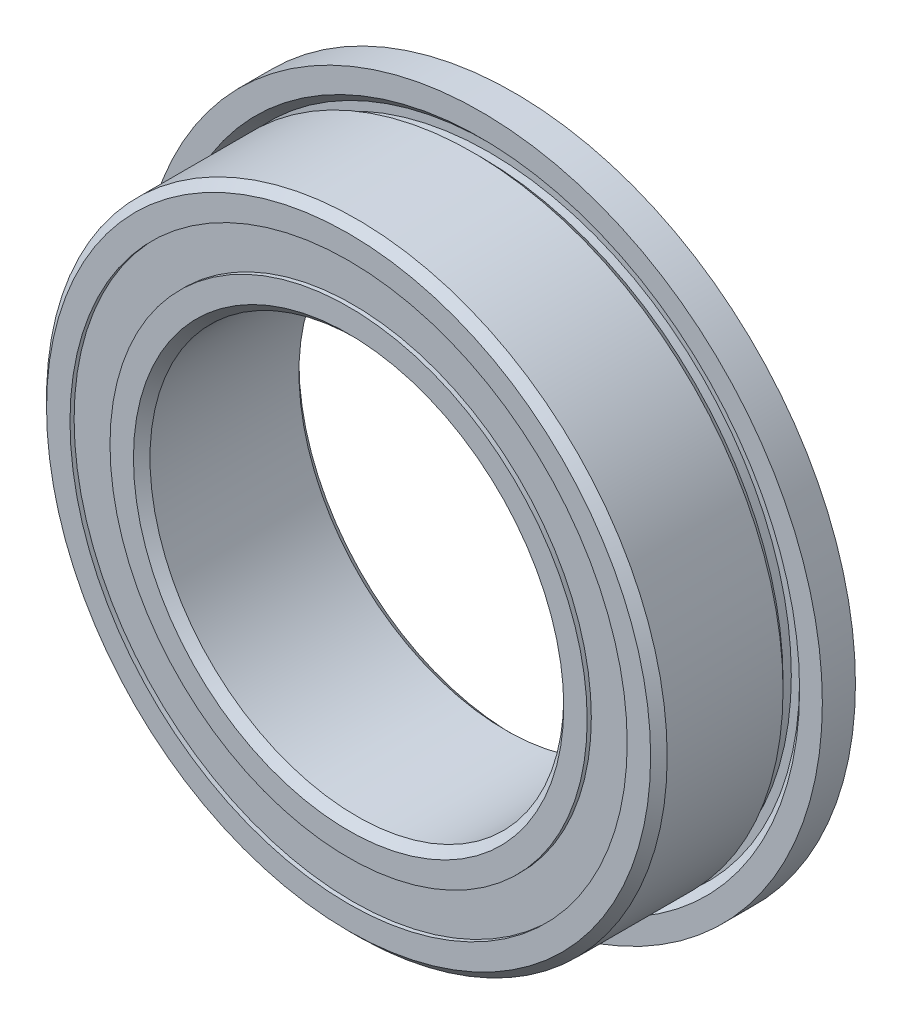
ISO-10303-21;
HEADER;
FILE_DESCRIPTION(('STEP AP214'),'2;1');
FILE_NAME('part.step','',(''),(''),'','','');
FILE_SCHEMA(('AUTOMOTIVE_DESIGN { 1 0 10303 214 1 1 1 1 }'));
ENDSEC;
DATA;
#1=APPLICATION_CONTEXT('core data for automotive mechanical design processes');
#2=APPLICATION_PROTOCOL_DEFINITION('international standard','automotive_design',2000,#1);
#3=PRODUCT_CONTEXT('',#1,'mechanical');
#4=PRODUCT('Part','Part','',(#3));
#5=PRODUCT_RELATED_PRODUCT_CATEGORY('part','',(#4));
#6=PRODUCT_DEFINITION_FORMATION('','',#4);
#7=PRODUCT_DEFINITION_CONTEXT('part definition',#1,'design');
#8=PRODUCT_DEFINITION('design','',#6,#7);
#9=PRODUCT_DEFINITION_SHAPE('','',#8);
#10=(LENGTH_UNIT() NAMED_UNIT(*) SI_UNIT(.MILLI.,.METRE.));
#11=(NAMED_UNIT(*) PLANE_ANGLE_UNIT() SI_UNIT($,.RADIAN.));
#12=(NAMED_UNIT(*) SI_UNIT($,.STERADIAN.) SOLID_ANGLE_UNIT());
#13=UNCERTAINTY_MEASURE_WITH_UNIT(LENGTH_MEASURE(1.E-05),#10,'distance_accuracy_value','');
#14=(GEOMETRIC_REPRESENTATION_CONTEXT(3) GLOBAL_UNCERTAINTY_ASSIGNED_CONTEXT((#13)) GLOBAL_UNIT_ASSIGNED_CONTEXT((#10,
#11,#12)) REPRESENTATION_CONTEXT('',''));
#15=CARTESIAN_POINT('',(0.,0.,0.));
#16=DIRECTION('',(0.,0.,1.));
#17=DIRECTION('',(1.,0.,0.));
#18=AXIS2_PLACEMENT_3D('',#15,#16,#17);
#19=CARTESIAN_POINT('',(0.,6.73351648351648,-1.90000000000002));
#20=DIRECTION('',(0.,0.,1.));
#21=DIRECTION('',(1.,0.,0.));
#22=AXIS2_PLACEMENT_3D('',#19,#20,#21);
#23=PLANE('',#22);
#24=CARTESIAN_POINT('',(0.,0.,-1.90000000000002));
#25=DIRECTION('',(0.,0.,1.));
#26=DIRECTION('',(1.,0.,0.));
#27=AXIS2_PLACEMENT_3D('',#24,#25,#26);
#28=CIRCLE('',#27,6.73351648351648);
#29=CARTESIAN_POINT('',(6.73351648351648,0.,-1.90000000000002));
#30=VERTEX_POINT('',#29);
#31=EDGE_CURVE('E57',#30,#30,#28,.T.);
#32=ORIENTED_EDGE('',*,*,#31,.F.);
#33=EDGE_LOOP('',(#32));
#34=FACE_BOUND('',#33,.T.);
#35=CARTESIAN_POINT('',(0.,0.,-1.90000000000002));
#36=DIRECTION('',(0.,0.,1.));
#37=DIRECTION('',(1.,0.,0.));
#38=AXIS2_PLACEMENT_3D('',#35,#36,#37);
#39=CIRCLE('',#38,5.76648351648353);
#40=CARTESIAN_POINT('',(5.76648351648353,0.,-1.90000000000002));
#41=VERTEX_POINT('',#40);
#42=EDGE_CURVE('E11',#41,#41,#39,.T.);
#43=ORIENTED_EDGE('',*,*,#42,.T.);
#44=EDGE_LOOP('',(#43));
#45=FACE_BOUND('',#44,.T.);
#46=ADVANCED_FACE('F43',(#34,#45),#23,.F.);
#47=CARTESIAN_POINT('',(0.,0.,2.));
#48=DIRECTION('',(0.,0.,1.));
#49=DIRECTION('',(1.,0.,0.));
#50=AXIS2_PLACEMENT_3D('',#47,#48,#49);
#51=CYLINDRICAL_SURFACE('',#50,5.76648351648353);
#52=ORIENTED_EDGE('',*,*,#42,.F.);
#53=EDGE_LOOP('',(#52));
#54=FACE_BOUND('',#53,.T.);
#55=CARTESIAN_POINT('',(0.,0.,-1.01188519438831));
#56=DIRECTION('',(0.,0.,1.));
#57=DIRECTION('',(1.,0.,0.));
#58=AXIS2_PLACEMENT_3D('',#55,#56,#57);
#59=CIRCLE('',#58,5.76648351648353);
#60=CARTESIAN_POINT('',(5.76648351648353,0.,-1.01188519438831));
#61=VERTEX_POINT('',#60);
#62=EDGE_CURVE('E49',#61,#61,#59,.T.);
#63=ORIENTED_EDGE('',*,*,#62,.T.);
#64=EDGE_LOOP('',(#63));
#65=FACE_BOUND('',#64,.T.);
#66=ADVANCED_FACE('F66',(#54,#65),#51,.F.);
#67=CARTESIAN_POINT('',(0.,6.73351648351648,-1.01188519438831));
#68=DIRECTION('',(0.,0.,-1.));
#69=DIRECTION('',(-1.,0.,0.));
#70=AXIS2_PLACEMENT_3D('',#67,#68,#69);
#71=PLANE('',#70);
#72=ORIENTED_EDGE('',*,*,#62,.F.);
#73=EDGE_LOOP('',(#72));
#74=FACE_BOUND('',#73,.T.);
#75=CARTESIAN_POINT('',(0.,0.,-1.01188519438831));
#76=DIRECTION('',(0.,0.,1.));
#77=DIRECTION('',(1.,0.,0.));
#78=AXIS2_PLACEMENT_3D('',#75,#76,#77);
#79=CIRCLE('',#78,6.73351648351648);
#80=CARTESIAN_POINT('',(6.73351648351648,0.,-1.01188519438831));
#81=VERTEX_POINT('',#80);
#82=EDGE_CURVE('E53',#81,#81,#79,.T.);
#83=ORIENTED_EDGE('',*,*,#82,.T.);
#84=EDGE_LOOP('',(#83));
#85=FACE_BOUND('',#84,.T.);
#86=ADVANCED_FACE('F70',(#74,#85),#71,.F.);
#87=CARTESIAN_POINT('',(0.,0.,2.));
#88=DIRECTION('',(0.,0.,1.));
#89=DIRECTION('',(1.,0.,0.));
#90=AXIS2_PLACEMENT_3D('',#87,#88,#89);
#91=CYLINDRICAL_SURFACE('',#90,6.73351648351648);
#92=ORIENTED_EDGE('',*,*,#82,.F.);
#93=EDGE_LOOP('',(#92));
#94=FACE_BOUND('',#93,.T.);
#95=ORIENTED_EDGE('',*,*,#31,.T.);
#96=EDGE_LOOP('',(#95));
#97=FACE_BOUND('',#96,.T.);
#98=ADVANCED_FACE('F63',(#94,#97),#91,.T.);
#99=CLOSED_SHELL('',(#46,#66,#86,#98));
#100=MANIFOLD_SOLID_BREP('B2',#99);
#101=CARTESIAN_POINT('',(0.,6.73351648351648,1.90000000000002));
#102=DIRECTION('',(0.,0.,-1.));
#103=DIRECTION('',(-1.,0.,0.));
#104=AXIS2_PLACEMENT_3D('',#101,#102,#103);
#105=PLANE('',#104);
#106=CARTESIAN_POINT('',(0.,0.,1.90000000000002));
#107=DIRECTION('',(0.,0.,1.));
#108=DIRECTION('',(1.,0.,0.));
#109=AXIS2_PLACEMENT_3D('',#106,#107,#108);
#110=CIRCLE('',#109,5.76648351648353);
#111=CARTESIAN_POINT('',(5.76648351648353,0.,1.90000000000002));
#112=VERTEX_POINT('',#111);
#113=EDGE_CURVE('E42',#112,#112,#110,.T.);
#114=ORIENTED_EDGE('',*,*,#113,.F.);
#115=EDGE_LOOP('',(#114));
#116=FACE_BOUND('',#115,.T.);
#117=CARTESIAN_POINT('',(0.,0.,1.90000000000002));
#118=DIRECTION('',(0.,0.,1.));
#119=DIRECTION('',(1.,0.,0.));
#120=AXIS2_PLACEMENT_3D('',#117,#118,#119);
#121=CIRCLE('',#120,6.73351648351648);
#122=CARTESIAN_POINT('',(6.73351648351648,0.,1.90000000000002));
#123=VERTEX_POINT('',#122);
#124=EDGE_CURVE('E124',#123,#123,#121,.T.);
#125=ORIENTED_EDGE('',*,*,#124,.T.);
#126=EDGE_LOOP('',(#125));
#127=FACE_BOUND('',#126,.T.);
#128=ADVANCED_FACE('F110',(#116,#127),#105,.F.);
#129=CARTESIAN_POINT('',(0.,0.,2.));
#130=DIRECTION('',(0.,0.,1.));
#131=DIRECTION('',(1.,0.,0.));
#132=AXIS2_PLACEMENT_3D('',#129,#130,#131);
#133=CYLINDRICAL_SURFACE('',#132,5.76648351648353);
#134=CARTESIAN_POINT('',(0.,0.,1.01188519438831));
#135=DIRECTION('',(0.,0.,1.));
#136=DIRECTION('',(1.,0.,0.));
#137=AXIS2_PLACEMENT_3D('',#134,#135,#136);
#138=CIRCLE('',#137,5.76648351648353);
#139=CARTESIAN_POINT('',(5.76648351648353,0.,1.01188519438831));
#140=VERTEX_POINT('',#139);
#141=EDGE_CURVE('E116',#140,#140,#138,.T.);
#142=ORIENTED_EDGE('',*,*,#141,.F.);
#143=EDGE_LOOP('',(#142));
#144=FACE_BOUND('',#143,.T.);
#145=ORIENTED_EDGE('',*,*,#113,.T.);
#146=EDGE_LOOP('',(#145));
#147=FACE_BOUND('',#146,.T.);
#148=ADVANCED_FACE('F139',(#144,#147),#133,.F.);
#149=CARTESIAN_POINT('',(0.,6.73351648351648,1.01188519438831));
#150=DIRECTION('',(0.,0.,1.));
#151=DIRECTION('',(1.,0.,0.));
#152=AXIS2_PLACEMENT_3D('',#149,#150,#151);
#153=PLANE('',#152);
#154=CARTESIAN_POINT('',(0.,0.,1.01188519438831));
#155=DIRECTION('',(0.,0.,1.));
#156=DIRECTION('',(1.,0.,0.));
#157=AXIS2_PLACEMENT_3D('',#154,#155,#156);
#158=CIRCLE('',#157,6.73351648351648);
#159=CARTESIAN_POINT('',(6.73351648351648,0.,1.01188519438831));
#160=VERTEX_POINT('',#159);
#161=EDGE_CURVE('E120',#160,#160,#158,.T.);
#162=ORIENTED_EDGE('',*,*,#161,.F.);
#163=EDGE_LOOP('',(#162));
#164=FACE_BOUND('',#163,.T.);
#165=ORIENTED_EDGE('',*,*,#141,.T.);
#166=EDGE_LOOP('',(#165));
#167=FACE_BOUND('',#166,.T.);
#168=ADVANCED_FACE('F134',(#164,#167),#153,.F.);
#169=CARTESIAN_POINT('',(0.,0.,2.));
#170=DIRECTION('',(0.,0.,1.));
#171=DIRECTION('',(1.,0.,0.));
#172=AXIS2_PLACEMENT_3D('',#169,#170,#171);
#173=CYLINDRICAL_SURFACE('',#172,6.73351648351648);
#174=ORIENTED_EDGE('',*,*,#124,.F.);
#175=EDGE_LOOP('',(#174));
#176=FACE_BOUND('',#175,.T.);
#177=ORIENTED_EDGE('',*,*,#161,.T.);
#178=EDGE_LOOP('',(#177));
#179=FACE_BOUND('',#178,.T.);
#180=ADVANCED_FACE('F131',(#176,#179),#173,.T.);
#181=CLOSED_SHELL('',(#128,#148,#168,#180));
#182=MANIFOLD_SOLID_BREP('B6',#181);
#183=CARTESIAN_POINT('',(-3.37900510909742,5.25783458019493,0.));
#184=DIRECTION('',(0.,0.,1.));
#185=DIRECTION('',(-0.540640817455587,0.841253532831188,0.));
#186=AXIS2_PLACEMENT_3D('',#183,#184,#185);
#187=SPHERICAL_SURFACE('',#186,1.01188519438831);
#188=CARTESIAN_POINT('',(-3.37900510909742,5.25783458019493,1.01188519438831));
#189=VERTEX_POINT('',#188);
#190=VERTEX_LOOP('',#189);
#191=FACE_BOUND('',#190,.T.);
#192=ADVANCED_FACE('F177',(#191),#187,.T.);
#193=CLOSED_SHELL('',(#192));
#194=MANIFOLD_SOLID_BREP('B37',#193);
#195=CARTESIAN_POINT('',(-5.68519997096571,2.59634383126185,0.));
#196=DIRECTION('',(0.,0.,1.));
#197=DIRECTION('',(-0.909631995354514,0.415415013001897,0.));
#198=AXIS2_PLACEMENT_3D('',#195,#196,#197);
#199=SPHERICAL_SURFACE('',#198,1.01188519438831);
#200=CARTESIAN_POINT('',(-5.68519997096571,2.59634383126185,1.01188519438831));
#201=VERTEX_POINT('',#200);
#202=VERTEX_LOOP('',#201);
#203=FACE_BOUND('',#202,.T.);
#204=ADVANCED_FACE('F197',(#203),#199,.T.);
#205=CLOSED_SHELL('',(#204));
#206=MANIFOLD_SOLID_BREP('B106',#205);
#207=CARTESIAN_POINT('',(-6.18638401175584,-0.889467739207972,0.));
#208=DIRECTION('',(0.,0.,1.));
#209=DIRECTION('',(-0.989821441880934,-0.142314838273276,0.));
#210=AXIS2_PLACEMENT_3D('',#207,#208,#209);
#211=SPHERICAL_SURFACE('',#210,1.01188519438831);
#212=CARTESIAN_POINT('',(-6.18638401175584,-0.889467739207972,1.01188519438831));
#213=VERTEX_POINT('',#212);
#214=VERTEX_LOOP('',#213);
#215=FACE_BOUND('',#214,.T.);
#216=ADVANCED_FACE('F217',(#215),#211,.T.);
#217=CLOSED_SHELL('',(#216));
#218=MANIFOLD_SOLID_BREP('B173',#217);
#219=CARTESIAN_POINT('',(-4.72343483971415,-4.09287958715799,0.));
#220=DIRECTION('',(0.,0.,1.));
#221=DIRECTION('',(-0.755749574354264,-0.654860733945279,0.));
#222=AXIS2_PLACEMENT_3D('',#219,#220,#221);
#223=SPHERICAL_SURFACE('',#222,1.01188519438831);
#224=CARTESIAN_POINT('',(-4.72343483971415,-4.09287958715799,1.01188519438831));
#225=VERTEX_POINT('',#224);
#226=VERTEX_LOOP('',#225);
#227=FACE_BOUND('',#226,.T.);
#228=ADVANCED_FACE('F237',(#227),#223,.T.);
#229=CLOSED_SHELL('',(#228));
#230=MANIFOLD_SOLID_BREP('B193',#229);
#231=CARTESIAN_POINT('',(-1.76082848025898,-5.9968310850906,0.));
#232=DIRECTION('',(0.,0.,1.));
#233=DIRECTION('',(-0.281732556841437,-0.959492973614495,0.));
#234=AXIS2_PLACEMENT_3D('',#231,#232,#233);
#235=SPHERICAL_SURFACE('',#234,1.01188519438831);
#236=CARTESIAN_POINT('',(-1.76082848025898,-5.9968310850906,1.01188519438831));
#237=VERTEX_POINT('',#236);
#238=VERTEX_LOOP('',#237);
#239=FACE_BOUND('',#238,.T.);
#240=ADVANCED_FACE('F257',(#239),#235,.T.);
#241=CLOSED_SHELL('',(#240));
#242=MANIFOLD_SOLID_BREP('B213',#241);
#243=CARTESIAN_POINT('',(1.7608284802589,-5.99683108509062,0.));
#244=DIRECTION('',(0.,0.,1.));
#245=DIRECTION('',(0.281732556841424,-0.959492973614499,0.));
#246=AXIS2_PLACEMENT_3D('',#243,#244,#245);
#247=SPHERICAL_SURFACE('',#246,1.01188519438831);
#248=CARTESIAN_POINT('',(1.7608284802589,-5.99683108509062,1.01188519438831));
#249=VERTEX_POINT('',#248);
#250=VERTEX_LOOP('',#249);
#251=FACE_BOUND('',#250,.T.);
#252=ADVANCED_FACE('F277',(#251),#247,.T.);
#253=CLOSED_SHELL('',(#252));
#254=MANIFOLD_SOLID_BREP('B233',#253);
#255=CARTESIAN_POINT('',(4.7234348397141,-4.09287958715805,0.));
#256=DIRECTION('',(0.,0.,1.));
#257=DIRECTION('',(0.755749574354255,-0.654860733945289,0.));
#258=AXIS2_PLACEMENT_3D('',#255,#256,#257);
#259=SPHERICAL_SURFACE('',#258,1.01188519438831);
#260=CARTESIAN_POINT('',(4.7234348397141,-4.09287958715805,1.01188519438831));
#261=VERTEX_POINT('',#260);
#262=VERTEX_LOOP('',#261);
#263=FACE_BOUND('',#262,.T.);
#264=ADVANCED_FACE('F297',(#263),#259,.T.);
#265=CLOSED_SHELL('',(#264));
#266=MANIFOLD_SOLID_BREP('B253',#265);
#267=CARTESIAN_POINT('',(6.18638401175583,-0.889467739208055,0.));
#268=DIRECTION('',(0.,0.,1.));
#269=DIRECTION('',(0.989821441880932,-0.142314838273289,0.));
#270=AXIS2_PLACEMENT_3D('',#267,#268,#269);
#271=SPHERICAL_SURFACE('',#270,1.01188519438831);
#272=CARTESIAN_POINT('',(6.18638401175583,-0.889467739208055,1.01188519438831));
#273=VERTEX_POINT('',#272);
#274=VERTEX_LOOP('',#273);
#275=FACE_BOUND('',#274,.T.);
#276=ADVANCED_FACE('F317',(#275),#271,.T.);
#277=CLOSED_SHELL('',(#276));
#278=MANIFOLD_SOLID_BREP('B273',#277);
#279=CARTESIAN_POINT('',(5.68519997096575,2.59634383126178,0.));
#280=DIRECTION('',(0.,0.,1.));
#281=DIRECTION('',(0.90963199535452,0.415415013001884,0.));
#282=AXIS2_PLACEMENT_3D('',#279,#280,#281);
#283=SPHERICAL_SURFACE('',#282,1.01188519438831);
#284=CARTESIAN_POINT('',(5.68519997096575,2.59634383126178,1.01188519438831));
#285=VERTEX_POINT('',#284);
#286=VERTEX_LOOP('',#285);
#287=FACE_BOUND('',#286,.T.);
#288=ADVANCED_FACE('F337',(#287),#283,.T.);
#289=CLOSED_SHELL('',(#288));
#290=MANIFOLD_SOLID_BREP('B293',#289);
#291=CARTESIAN_POINT('',(3.37900510909749,5.25783458019488,0.));
#292=DIRECTION('',(0.,0.,1.));
#293=DIRECTION('',(0.540640817455599,0.841253532831181,0.));
#294=AXIS2_PLACEMENT_3D('',#291,#292,#293);
#295=SPHERICAL_SURFACE('',#294,1.01188519438831);
#296=CARTESIAN_POINT('',(3.37900510909749,5.25783458019488,1.01188519438831));
#297=VERTEX_POINT('',#296);
#298=VERTEX_LOOP('',#297);
#299=FACE_BOUND('',#298,.T.);
#300=ADVANCED_FACE('F357',(#299),#295,.T.);
#301=CLOSED_SHELL('',(#300));
#302=MANIFOLD_SOLID_BREP('B313',#301);
#303=CARTESIAN_POINT('',(0.,6.25,0.));
#304=DIRECTION('',(0.,0.,1.));
#305=DIRECTION('',(0.,1.,0.));
#306=AXIS2_PLACEMENT_3D('',#303,#304,#305);
#307=SPHERICAL_SURFACE('',#306,1.01188519438831);
#308=CARTESIAN_POINT('',(0.,6.25,1.01188519438831));
#309=VERTEX_POINT('',#308);
#310=VERTEX_LOOP('',#309);
#311=FACE_BOUND('',#310,.T.);
#312=ADVANCED_FACE('F379',(#311),#307,.T.);
#313=CLOSED_SHELL('',(#312));
#314=MANIFOLD_SOLID_BREP('B333',#313);
#315=CARTESIAN_POINT('',(0.,6.49175824175824,0.0805860805860799));
#316=DIRECTION('',(0.,0.,-1.));
#317=DIRECTION('',(-1.,0.,0.));
#318=AXIS2_PLACEMENT_3D('',#315,#316,#317);
#319=PLANE('',#318);
#320=CARTESIAN_POINT('',(0.,0.,0.0805860805860798));
#321=DIRECTION('',(0.,0.,1.));
#322=DIRECTION('',(1.,0.,0.));
#323=AXIS2_PLACEMENT_3D('',#320,#321,#322);
#324=CIRCLE('',#323,6.00824175824176);
#325=CARTESIAN_POINT('',(6.00824175824176,0.,0.0805860805860798));
#326=VERTEX_POINT('',#325);
#327=EDGE_CURVE('E378',#326,#326,#324,.T.);
#328=ORIENTED_EDGE('',*,*,#327,.F.);
#329=EDGE_LOOP('',(#328));
#330=FACE_BOUND('',#329,.T.);
#331=CARTESIAN_POINT('',(0.,0.,0.0805860805860798));
#332=DIRECTION('',(0.,0.,1.));
#333=DIRECTION('',(1.,0.,0.));
#334=AXIS2_PLACEMENT_3D('',#331,#332,#333);
#335=CIRCLE('',#334,6.49175824175824);
#336=CARTESIAN_POINT('',(6.49175824175824,0.,0.0805860805860798));
#337=VERTEX_POINT('',#336);
#338=EDGE_CURVE('E413',#337,#337,#335,.T.);
#339=ORIENTED_EDGE('',*,*,#338,.T.);
#340=EDGE_LOOP('',(#339));
#341=FACE_BOUND('',#340,.T.);
#342=ADVANCED_FACE('F399',(#330,#341),#319,.F.);
#343=CARTESIAN_POINT('',(0.,0.,2.));
#344=DIRECTION('',(0.,0.,1.));
#345=DIRECTION('',(1.,0.,0.));
#346=AXIS2_PLACEMENT_3D('',#343,#344,#345);
#347=CYLINDRICAL_SURFACE('',#346,6.00824175824176);
#348=CARTESIAN_POINT('',(0.,0.,-0.0805860805860813));
#349=DIRECTION('',(0.,0.,1.));
#350=DIRECTION('',(1.,0.,0.));
#351=AXIS2_PLACEMENT_3D('',#348,#349,#350);
#352=CIRCLE('',#351,6.00824175824176);
#353=CARTESIAN_POINT('',(6.00824175824176,0.,-0.0805860805860813));
#354=VERTEX_POINT('',#353);
#355=EDGE_CURVE('E405',#354,#354,#352,.T.);
#356=ORIENTED_EDGE('',*,*,#355,.F.);
#357=EDGE_LOOP('',(#356));
#358=FACE_BOUND('',#357,.T.);
#359=ORIENTED_EDGE('',*,*,#327,.T.);
#360=EDGE_LOOP('',(#359));
#361=FACE_BOUND('',#360,.T.);
#362=ADVANCED_FACE('F428',(#358,#361),#347,.F.);
#363=CARTESIAN_POINT('',(0.,6.49175824175824,-0.0805860805860815));
#364=DIRECTION('',(0.,0.,1.));
#365=DIRECTION('',(1.,0.,0.));
#366=AXIS2_PLACEMENT_3D('',#363,#364,#365);
#367=PLANE('',#366);
#368=CARTESIAN_POINT('',(0.,0.,-0.0805860805860813));
#369=DIRECTION('',(0.,0.,1.));
#370=DIRECTION('',(1.,0.,0.));
#371=AXIS2_PLACEMENT_3D('',#368,#369,#370);
#372=CIRCLE('',#371,6.49175824175824);
#373=CARTESIAN_POINT('',(6.49175824175824,0.,-0.0805860805860813));
#374=VERTEX_POINT('',#373);
#375=EDGE_CURVE('E409',#374,#374,#372,.T.);
#376=ORIENTED_EDGE('',*,*,#375,.F.);
#377=EDGE_LOOP('',(#376));
#378=FACE_BOUND('',#377,.T.);
#379=ORIENTED_EDGE('',*,*,#355,.T.);
#380=EDGE_LOOP('',(#379));
#381=FACE_BOUND('',#380,.T.);
#382=ADVANCED_FACE('F423',(#378,#381),#367,.F.);
#383=CARTESIAN_POINT('',(0.,0.,2.));
#384=DIRECTION('',(0.,0.,1.));
#385=DIRECTION('',(1.,0.,0.));
#386=AXIS2_PLACEMENT_3D('',#383,#384,#385);
#387=CYLINDRICAL_SURFACE('',#386,6.49175824175824);
#388=ORIENTED_EDGE('',*,*,#338,.F.);
#389=EDGE_LOOP('',(#388));
#390=FACE_BOUND('',#389,.T.);
#391=ORIENTED_EDGE('',*,*,#375,.T.);
#392=EDGE_LOOP('',(#391));
#393=FACE_BOUND('',#392,.T.);
#394=ADVANCED_FACE('F420',(#390,#393),#387,.T.);
#395=CLOSED_SHELL('',(#342,#362,#382,#394));
#396=MANIFOLD_SOLID_BREP('B353',#395);
#397=CARTESIAN_POINT('',(0.,5.76648351648353,2.));
#398=DIRECTION('',(0.,0.,-1.));
#399=DIRECTION('',(-1.,0.,0.));
#400=AXIS2_PLACEMENT_3D('',#397,#398,#399);
#401=PLANE('',#400);
#402=CARTESIAN_POINT('',(0.,0.,2.));
#403=DIRECTION('',(0.,0.,1.));
#404=DIRECTION('',(1.,0.,0.));
#405=AXIS2_PLACEMENT_3D('',#402,#403,#404);
#406=CIRCLE('',#405,5.19999999999997);
#407=CARTESIAN_POINT('',(5.19999999999997,0.,2.));
#408=VERTEX_POINT('',#407);
#409=EDGE_CURVE('E495',#408,#408,#406,.T.);
#410=ORIENTED_EDGE('',*,*,#409,.F.);
#411=EDGE_LOOP('',(#410));
#412=FACE_BOUND('',#411,.T.);
#413=CARTESIAN_POINT('',(0.,0.,2.));
#414=DIRECTION('',(0.,0.,1.));
#415=DIRECTION('',(1.,0.,0.));
#416=AXIS2_PLACEMENT_3D('',#413,#414,#415);
#417=CIRCLE('',#416,5.76648351648353);
#418=CARTESIAN_POINT('',(5.76648351648353,0.,2.));
#419=VERTEX_POINT('',#418);
#420=EDGE_CURVE('E398',#419,#419,#417,.T.);
#421=ORIENTED_EDGE('',*,*,#420,.T.);
#422=EDGE_LOOP('',(#421));
#423=FACE_BOUND('',#422,.T.);
#424=ADVANCED_FACE('F467',(#412,#423),#401,.F.);
#425=CARTESIAN_POINT('',(0.,0.,2.));
#426=DIRECTION('',(0.,0.,1.));
#427=DIRECTION('',(1.,0.,0.));
#428=AXIS2_PLACEMENT_3D('',#425,#426,#427);
#429=CYLINDRICAL_SURFACE('',#428,5.76648351648353);
#430=ORIENTED_EDGE('',*,*,#420,.F.);
#431=EDGE_LOOP('',(#430));
#432=FACE_BOUND('',#431,.T.);
#433=CARTESIAN_POINT('',(0.,0.,0.888888888888888));
#434=DIRECTION('',(0.,0.,1.));
#435=DIRECTION('',(1.,0.,0.));
#436=AXIS2_PLACEMENT_3D('',#433,#434,#435);
#437=CIRCLE('',#436,5.76648351648353);
#438=CARTESIAN_POINT('',(5.76648351648353,0.,0.888888888888888));
#439=VERTEX_POINT('',#438);
#440=EDGE_CURVE('E473',#439,#439,#437,.T.);
#441=ORIENTED_EDGE('',*,*,#440,.T.);
#442=EDGE_LOOP('',(#441));
#443=FACE_BOUND('',#442,.T.);
#444=ADVANCED_FACE('F502',(#432,#443),#429,.T.);
#445=CARTESIAN_POINT('',(0.,0.,0.));
#446=DIRECTION('',(0.,0.,1.));
#447=DIRECTION('',(1.,0.,0.));
#448=AXIS2_PLACEMENT_3D('',#445,#446,#447);
#449=TOROIDAL_SURFACE('',#448,6.25000000000002,1.01188519438831);
#450=ORIENTED_EDGE('',*,*,#440,.F.);
#451=EDGE_LOOP('',(#450));
#452=FACE_BOUND('',#451,.T.);
#453=CARTESIAN_POINT('',(0.,0.,-0.888888888888889));
#454=DIRECTION('',(0.,0.,1.));
#455=DIRECTION('',(1.,0.,0.));
#456=AXIS2_PLACEMENT_3D('',#453,#454,#455);
#457=CIRCLE('',#456,5.76648351648353);
#458=CARTESIAN_POINT('',(5.76648351648353,0.,-0.888888888888889));
#459=VERTEX_POINT('',#458);
#460=EDGE_CURVE('E477',#459,#459,#457,.T.);
#461=ORIENTED_EDGE('',*,*,#460,.T.);
#462=EDGE_LOOP('',(#461));
#463=FACE_BOUND('',#462,.T.);
#464=ADVANCED_FACE('F506',(#452,#463),#449,.F.);
#465=CARTESIAN_POINT('',(0.,0.,2.));
#466=DIRECTION('',(0.,0.,1.));
#467=DIRECTION('',(1.,0.,0.));
#468=AXIS2_PLACEMENT_3D('',#465,#466,#467);
#469=CYLINDRICAL_SURFACE('',#468,5.76648351648353);
#470=ORIENTED_EDGE('',*,*,#460,.F.);
#471=EDGE_LOOP('',(#470));
#472=FACE_BOUND('',#471,.T.);
#473=CARTESIAN_POINT('',(0.,0.,-2.));
#474=DIRECTION('',(0.,0.,1.));
#475=DIRECTION('',(1.,0.,0.));
#476=AXIS2_PLACEMENT_3D('',#473,#474,#475);
#477=CIRCLE('',#476,5.76648351648353);
#478=CARTESIAN_POINT('',(5.76648351648353,0.,-2.));
#479=VERTEX_POINT('',#478);
#480=EDGE_CURVE('E481',#479,#479,#477,.T.);
#481=ORIENTED_EDGE('',*,*,#480,.T.);
#482=EDGE_LOOP('',(#481));
#483=FACE_BOUND('',#482,.T.);
#484=ADVANCED_FACE('F511',(#472,#483),#469,.T.);
#485=CARTESIAN_POINT('',(0.,5.19999999999996,-2.));
#486=DIRECTION('',(0.,0.,1.));
#487=DIRECTION('',(1.,0.,0.));
#488=AXIS2_PLACEMENT_3D('',#485,#486,#487);
#489=PLANE('',#488);
#490=ORIENTED_EDGE('',*,*,#480,.F.);
#491=EDGE_LOOP('',(#490));
#492=FACE_BOUND('',#491,.T.);
#493=CARTESIAN_POINT('',(0.,0.,-2.));
#494=DIRECTION('',(0.,0.,1.));
#495=DIRECTION('',(1.,0.,0.));
#496=AXIS2_PLACEMENT_3D('',#493,#494,#495);
#497=CIRCLE('',#496,5.19999999999996);
#498=CARTESIAN_POINT('',(5.19999999999996,0.,-2.));
#499=VERTEX_POINT('',#498);
#500=EDGE_CURVE('E486',#499,#499,#497,.T.);
#501=ORIENTED_EDGE('',*,*,#500,.T.);
#502=EDGE_LOOP('',(#501));
#503=FACE_BOUND('',#502,.T.);
#504=ADVANCED_FACE('F517',(#492,#503),#489,.F.);
#505=CARTESIAN_POINT('',(0.,0.,-1.80000000000004));
#506=DIRECTION('',(0.,0.,-1.));
#507=DIRECTION('',(-1.,0.,0.));
#508=AXIS2_PLACEMENT_3D('',#505,#506,#507);
#509=CONICAL_SURFACE('',#508,5.,0.785398163397438);
#510=ORIENTED_EDGE('',*,*,#500,.F.);
#511=EDGE_LOOP('',(#510));
#512=FACE_BOUND('',#511,.T.);
#513=CARTESIAN_POINT('',(0.,0.,-1.80000000000004));
#514=DIRECTION('',(0.,0.,1.));
#515=DIRECTION('',(1.,0.,0.));
#516=AXIS2_PLACEMENT_3D('',#513,#514,#515);
#517=CIRCLE('',#516,5.);
#518=CARTESIAN_POINT('',(5.,0.,-1.80000000000004));
#519=VERTEX_POINT('',#518);
#520=EDGE_CURVE('E489',#519,#519,#517,.T.);
#521=ORIENTED_EDGE('',*,*,#520,.T.);
#522=EDGE_LOOP('',(#521));
#523=FACE_BOUND('',#522,.T.);
#524=ADVANCED_FACE('F521',(#512,#523),#509,.F.);
#525=CARTESIAN_POINT('',(0.,0.,2.));
#526=DIRECTION('',(0.,0.,1.));
#527=DIRECTION('',(1.,0.,0.));
#528=AXIS2_PLACEMENT_3D('',#525,#526,#527);
#529=CYLINDRICAL_SURFACE('',#528,5.);
#530=ORIENTED_EDGE('',*,*,#520,.F.);
#531=EDGE_LOOP('',(#530));
#532=FACE_BOUND('',#531,.T.);
#533=CARTESIAN_POINT('',(0.,0.,1.80000000000004));
#534=DIRECTION('',(0.,0.,1.));
#535=DIRECTION('',(1.,0.,0.));
#536=AXIS2_PLACEMENT_3D('',#533,#534,#535);
#537=CIRCLE('',#536,5.);
#538=CARTESIAN_POINT('',(5.,0.,1.80000000000004));
#539=VERTEX_POINT('',#538);
#540=EDGE_CURVE('E492',#539,#539,#537,.T.);
#541=ORIENTED_EDGE('',*,*,#540,.T.);
#542=EDGE_LOOP('',(#541));
#543=FACE_BOUND('',#542,.T.);
#544=ADVANCED_FACE('F525',(#532,#543),#529,.F.);
#545=CARTESIAN_POINT('',(0.,0.,2.));
#546=DIRECTION('',(0.,0.,1.));
#547=DIRECTION('',(1.,0.,0.));
#548=AXIS2_PLACEMENT_3D('',#545,#546,#547);
#549=CONICAL_SURFACE('',#548,5.19999999999997,0.785398163397462);
#550=ORIENTED_EDGE('',*,*,#540,.F.);
#551=EDGE_LOOP('',(#550));
#552=FACE_BOUND('',#551,.T.);
#553=ORIENTED_EDGE('',*,*,#409,.T.);
#554=EDGE_LOOP('',(#553));
#555=FACE_BOUND('',#554,.T.);
#556=ADVANCED_FACE('F499',(#552,#555),#549,.F.);
#557=CLOSED_SHELL('',(#424,#444,#464,#484,#504,#524,#544,#556));
#558=MANIFOLD_SOLID_BREP('B373',#557);
#559=CARTESIAN_POINT('',(0.,0.,2.));
#560=DIRECTION('',(0.,0.,1.));
#561=DIRECTION('',(1.,0.,0.));
#562=AXIS2_PLACEMENT_3D('',#559,#560,#561);
#563=CYLINDRICAL_SURFACE('',#562,8.25);
#564=CARTESIAN_POINT('',(0.,0.,-1.2));
#565=DIRECTION('',(0.,0.,1.));
#566=DIRECTION('',(1.,0.,0.));
#567=AXIS2_PLACEMENT_3D('',#564,#565,#566);
#568=CIRCLE('',#567,8.25);
#569=CARTESIAN_POINT('',(8.25,0.,-1.2));
#570=VERTEX_POINT('',#569);
#571=EDGE_CURVE('E594',#570,#570,#568,.T.);
#572=ORIENTED_EDGE('',*,*,#571,.F.);
#573=EDGE_LOOP('',(#572));
#574=FACE_BOUND('',#573,.T.);
#575=CARTESIAN_POINT('',(0.,0.,-2.));
#576=DIRECTION('',(0.,0.,1.));
#577=DIRECTION('',(1.,0.,0.));
#578=AXIS2_PLACEMENT_3D('',#575,#576,#577);
#579=CIRCLE('',#578,8.25);
#580=CARTESIAN_POINT('',(8.25,0.,-2.));
#581=VERTEX_POINT('',#580);
#582=EDGE_CURVE('E466',#581,#581,#579,.T.);
#583=ORIENTED_EDGE('',*,*,#582,.T.);
#584=EDGE_LOOP('',(#583));
#585=FACE_BOUND('',#584,.T.);
#586=ADVANCED_FACE('F588',(#574,#585),#563,.T.);
#587=CARTESIAN_POINT('',(0.,8.25,-1.2));
#588=DIRECTION('',(0.,0.,-1.));
#589=DIRECTION('',(-1.,0.,0.));
#590=AXIS2_PLACEMENT_3D('',#587,#588,#589);
#591=PLANE('',#590);
#592=CARTESIAN_POINT('',(0.,0.,-1.2));
#593=DIRECTION('',(0.,0.,1.));
#594=DIRECTION('',(1.,0.,0.));
#595=AXIS2_PLACEMENT_3D('',#592,#593,#594);
#596=CIRCLE('',#595,7.69999999999997);
#597=CARTESIAN_POINT('',(7.69999999999997,0.,-1.2));
#598=VERTEX_POINT('',#597);
#599=EDGE_CURVE('E598',#598,#598,#596,.T.);
#600=ORIENTED_EDGE('',*,*,#599,.F.);
#601=EDGE_LOOP('',(#600));
#602=FACE_BOUND('',#601,.T.);
#603=ORIENTED_EDGE('',*,*,#571,.T.);
#604=EDGE_LOOP('',(#603));
#605=FACE_BOUND('',#604,.T.);
#606=ADVANCED_FACE('F694',(#602,#605),#591,.F.);
#607=CARTESIAN_POINT('',(0.,0.,-1.2));
#608=DIRECTION('',(0.,0.,1.));
#609=DIRECTION('',(1.,0.,0.));
#610=AXIS2_PLACEMENT_3D('',#607,#608,#609);
#611=CONICAL_SURFACE('',#610,7.69999999999997,0.785398163397407);
#612=CARTESIAN_POINT('',(0.,0.,-1.39999999999997));
#613=DIRECTION('',(0.,0.,1.));
#614=DIRECTION('',(1.,0.,0.));
#615=AXIS2_PLACEMENT_3D('',#612,#613,#614);
#616=CIRCLE('',#615,7.50000000000002);
#617=CARTESIAN_POINT('',(7.50000000000002,0.,-1.39999999999997));
#618=VERTEX_POINT('',#617);
#619=EDGE_CURVE('E602',#618,#618,#616,.T.);
#620=ORIENTED_EDGE('',*,*,#619,.F.);
#621=EDGE_LOOP('',(#620));
#622=FACE_BOUND('',#621,.T.);
#623=ORIENTED_EDGE('',*,*,#599,.T.);
#624=EDGE_LOOP('',(#623));
#625=FACE_BOUND('',#624,.T.);
#626=ADVANCED_FACE('F688',(#622,#625),#611,.F.);
#627=CARTESIAN_POINT('',(0.,7.50000000000002,-1.39999999999997));
#628=DIRECTION('',(0.,0.,-1.));
#629=DIRECTION('',(-1.,0.,0.));
#630=AXIS2_PLACEMENT_3D('',#627,#628,#629);
#631=PLANE('',#630);
#632=CARTESIAN_POINT('',(0.,0.,-1.39999999999997));
#633=DIRECTION('',(0.,0.,1.));
#634=DIRECTION('',(1.,0.,0.));
#635=AXIS2_PLACEMENT_3D('',#632,#633,#634);
#636=CIRCLE('',#635,7.30000000000006);
#637=CARTESIAN_POINT('',(7.30000000000006,0.,-1.39999999999997));
#638=VERTEX_POINT('',#637);
#639=EDGE_CURVE('E607',#638,#638,#636,.T.);
#640=ORIENTED_EDGE('',*,*,#639,.F.);
#641=EDGE_LOOP('',(#640));
#642=FACE_BOUND('',#641,.T.);
#643=ORIENTED_EDGE('',*,*,#619,.T.);
#644=EDGE_LOOP('',(#643));
#645=FACE_BOUND('',#644,.T.);
#646=ADVANCED_FACE('F682',(#642,#645),#631,.F.);
#647=CARTESIAN_POINT('',(0.,0.,2.));
#648=DIRECTION('',(0.,0.,1.));
#649=DIRECTION('',(1.,0.,0.));
#650=AXIS2_PLACEMENT_3D('',#647,#648,#649);
#651=CYLINDRICAL_SURFACE('',#650,7.30000000000006);
#652=CARTESIAN_POINT('',(0.,0.,-1.2));
#653=DIRECTION('',(0.,0.,1.));
#654=DIRECTION('',(1.,0.,0.));
#655=AXIS2_PLACEMENT_3D('',#652,#653,#654);
#656=CIRCLE('',#655,7.30000000000006);
#657=CARTESIAN_POINT('',(7.30000000000006,0.,-1.2));
#658=VERTEX_POINT('',#657);
#659=EDGE_CURVE('E610',#658,#658,#656,.T.);
#660=ORIENTED_EDGE('',*,*,#659,.F.);
#661=EDGE_LOOP('',(#660));
#662=FACE_BOUND('',#661,.T.);
#663=ORIENTED_EDGE('',*,*,#639,.T.);
#664=EDGE_LOOP('',(#663));
#665=FACE_BOUND('',#664,.T.);
#666=ADVANCED_FACE('F676',(#662,#665),#651,.T.);
#667=CARTESIAN_POINT('',(0.,0.,-1.2));
#668=DIRECTION('',(0.,0.,1.));
#669=DIRECTION('',(1.,0.,0.));
#670=AXIS2_PLACEMENT_3D('',#667,#668,#669);
#671=CONICAL_SURFACE('',#670,7.30000000000006,0.785398163397429);
#672=CARTESIAN_POINT('',(0.,0.,-1.00000000000004));
#673=DIRECTION('',(0.,0.,1.));
#674=DIRECTION('',(1.,0.,0.));
#675=AXIS2_PLACEMENT_3D('',#672,#673,#674);
#676=CIRCLE('',#675,7.50000000000001);
#677=CARTESIAN_POINT('',(7.50000000000001,0.,-1.00000000000004));
#678=VERTEX_POINT('',#677);
#679=EDGE_CURVE('E613',#678,#678,#676,.T.);
#680=ORIENTED_EDGE('',*,*,#679,.F.);
#681=EDGE_LOOP('',(#680));
#682=FACE_BOUND('',#681,.T.);
#683=ORIENTED_EDGE('',*,*,#659,.T.);
#684=EDGE_LOOP('',(#683));
#685=FACE_BOUND('',#684,.T.);
#686=ADVANCED_FACE('F670',(#682,#685),#671,.T.);
#687=CARTESIAN_POINT('',(0.,0.,2.));
#688=DIRECTION('',(0.,0.,1.));
#689=DIRECTION('',(1.,0.,0.));
#690=AXIS2_PLACEMENT_3D('',#687,#688,#689);
#691=CYLINDRICAL_SURFACE('',#690,7.50000000000001);
#692=CARTESIAN_POINT('',(0.,0.,1.80000000000003));
#693=DIRECTION('',(0.,0.,1.));
#694=DIRECTION('',(1.,0.,0.));
#695=AXIS2_PLACEMENT_3D('',#692,#693,#694);
#696=CIRCLE('',#695,7.50000000000001);
#697=CARTESIAN_POINT('',(7.50000000000001,0.,1.80000000000003));
#698=VERTEX_POINT('',#697);
#699=EDGE_CURVE('E616',#698,#698,#696,.T.);
#700=ORIENTED_EDGE('',*,*,#699,.F.);
#701=EDGE_LOOP('',(#700));
#702=FACE_BOUND('',#701,.T.);
#703=ORIENTED_EDGE('',*,*,#679,.T.);
#704=EDGE_LOOP('',(#703));
#705=FACE_BOUND('',#704,.T.);
#706=ADVANCED_FACE('F664',(#702,#705),#691,.T.);
#707=CARTESIAN_POINT('',(0.,0.,1.80000000000003));
#708=DIRECTION('',(0.,0.,-1.));
#709=DIRECTION('',(-1.,0.,0.));
#710=AXIS2_PLACEMENT_3D('',#707,#708,#709);
#711=CONICAL_SURFACE('',#710,7.50000000000001,0.785398163397438);
#712=CARTESIAN_POINT('',(0.,0.,2.));
#713=DIRECTION('',(0.,0.,1.));
#714=DIRECTION('',(1.,0.,0.));
#715=AXIS2_PLACEMENT_3D('',#712,#713,#714);
#716=CIRCLE('',#715,7.30000000000005);
#717=CARTESIAN_POINT('',(7.30000000000005,0.,2.));
#718=VERTEX_POINT('',#717);
#719=EDGE_CURVE('E619',#718,#718,#716,.T.);
#720=ORIENTED_EDGE('',*,*,#719,.F.);
#721=EDGE_LOOP('',(#720));
#722=FACE_BOUND('',#721,.T.);
#723=ORIENTED_EDGE('',*,*,#699,.T.);
#724=EDGE_LOOP('',(#723));
#725=FACE_BOUND('',#724,.T.);
#726=ADVANCED_FACE('F658',(#722,#725),#711,.T.);
#727=CARTESIAN_POINT('',(0.,7.30000000000005,2.));
#728=DIRECTION('',(0.,0.,-1.));
#729=DIRECTION('',(-1.,0.,0.));
#730=AXIS2_PLACEMENT_3D('',#727,#728,#729);
#731=PLANE('',#730);
#732=CARTESIAN_POINT('',(0.,0.,2.00000000000001));
#733=DIRECTION('',(0.,0.,1.));
#734=DIRECTION('',(1.,0.,0.));
#735=AXIS2_PLACEMENT_3D('',#732,#733,#734);
#736=CIRCLE('',#735,6.73351648351648);
#737=CARTESIAN_POINT('',(6.73351648351648,0.,2.00000000000001));
#738=VERTEX_POINT('',#737);
#739=EDGE_CURVE('E622',#738,#738,#736,.T.);
#740=ORIENTED_EDGE('',*,*,#739,.F.);
#741=EDGE_LOOP('',(#740));
#742=FACE_BOUND('',#741,.T.);
#743=ORIENTED_EDGE('',*,*,#719,.T.);
#744=EDGE_LOOP('',(#743));
#745=FACE_BOUND('',#744,.T.);
#746=ADVANCED_FACE('F652',(#742,#745),#731,.F.);
#747=CARTESIAN_POINT('',(0.,0.,2.));
#748=DIRECTION('',(0.,0.,1.));
#749=DIRECTION('',(1.,0.,0.));
#750=AXIS2_PLACEMENT_3D('',#747,#748,#749);
#751=CYLINDRICAL_SURFACE('',#750,6.73351648351648);
#752=CARTESIAN_POINT('',(0.,0.,0.888888888888888));
#753=DIRECTION('',(0.,0.,1.));
#754=DIRECTION('',(1.,0.,0.));
#755=AXIS2_PLACEMENT_3D('',#752,#753,#754);
#756=CIRCLE('',#755,6.73351648351648);
#757=CARTESIAN_POINT('',(6.73351648351648,0.,0.888888888888888));
#758=VERTEX_POINT('',#757);
#759=EDGE_CURVE('E625',#758,#758,#756,.T.);
#760=ORIENTED_EDGE('',*,*,#759,.F.);
#761=EDGE_LOOP('',(#760));
#762=FACE_BOUND('',#761,.T.);
#763=ORIENTED_EDGE('',*,*,#739,.T.);
#764=EDGE_LOOP('',(#763));
#765=FACE_BOUND('',#764,.T.);
#766=ADVANCED_FACE('F646',(#762,#765),#751,.F.);
#767=CARTESIAN_POINT('',(0.,0.,0.));
#768=DIRECTION('',(0.,0.,1.));
#769=DIRECTION('',(1.,0.,0.));
#770=AXIS2_PLACEMENT_3D('',#767,#768,#769);
#771=TOROIDAL_SURFACE('',#770,6.25,1.01188519438831);
#772=CARTESIAN_POINT('',(0.,0.,-0.88888888888889));
#773=DIRECTION('',(0.,0.,1.));
#774=DIRECTION('',(1.,0.,0.));
#775=AXIS2_PLACEMENT_3D('',#772,#773,#774);
#776=CIRCLE('',#775,6.73351648351648);
#777=CARTESIAN_POINT('',(6.73351648351648,0.,-0.88888888888889));
#778=VERTEX_POINT('',#777);
#779=EDGE_CURVE('E628',#778,#778,#776,.T.);
#780=ORIENTED_EDGE('',*,*,#779,.F.);
#781=EDGE_LOOP('',(#780));
#782=FACE_BOUND('',#781,.T.);
#783=ORIENTED_EDGE('',*,*,#759,.T.);
#784=EDGE_LOOP('',(#783));
#785=FACE_BOUND('',#784,.T.);
#786=ADVANCED_FACE('F640',(#782,#785),#771,.F.);
#787=CARTESIAN_POINT('',(0.,0.,2.));
#788=DIRECTION('',(0.,0.,1.));
#789=DIRECTION('',(1.,0.,0.));
#790=AXIS2_PLACEMENT_3D('',#787,#788,#789);
#791=CYLINDRICAL_SURFACE('',#790,6.73351648351648);
#792=CARTESIAN_POINT('',(0.,0.,-2.00000000000001));
#793=DIRECTION('',(0.,0.,1.));
#794=DIRECTION('',(1.,0.,0.));
#795=AXIS2_PLACEMENT_3D('',#792,#793,#794);
#796=CIRCLE('',#795,6.73351648351648);
#797=CARTESIAN_POINT('',(6.73351648351648,0.,-2.00000000000001));
#798=VERTEX_POINT('',#797);
#799=EDGE_CURVE('E631',#798,#798,#796,.T.);
#800=ORIENTED_EDGE('',*,*,#799,.F.);
#801=EDGE_LOOP('',(#800));
#802=FACE_BOUND('',#801,.T.);
#803=ORIENTED_EDGE('',*,*,#779,.T.);
#804=EDGE_LOOP('',(#803));
#805=FACE_BOUND('',#804,.T.);
#806=ADVANCED_FACE('F637',(#802,#805),#791,.F.);
#807=CARTESIAN_POINT('',(0.,6.73351648351648,-2.));
#808=DIRECTION('',(0.,0.,1.));
#809=DIRECTION('',(1.,0.,0.));
#810=AXIS2_PLACEMENT_3D('',#807,#808,#809);
#811=PLANE('',#810);
#812=ORIENTED_EDGE('',*,*,#582,.F.);
#813=EDGE_LOOP('',(#812));
#814=FACE_BOUND('',#813,.T.);
#815=ORIENTED_EDGE('',*,*,#799,.T.);
#816=EDGE_LOOP('',(#815));
#817=FACE_BOUND('',#816,.T.);
#818=ADVANCED_FACE('F635',(#814,#817),#811,.F.);
#819=CLOSED_SHELL('',(#586,#606,#626,#646,#666,#686,#706,#726,#746,#766,#786,#806,#818));
#820=MANIFOLD_SOLID_BREP('B393',#819);
#821=ADVANCED_BREP_SHAPE_REPRESENTATION('',(#18,#100,#182,#194,#206,#218,#230,#242,#254,#266,
#278,#290,#302,#314,#396,#558,#820),#14);
#822=SHAPE_DEFINITION_REPRESENTATION(#9,#821);
ENDSEC;
END-ISO-10303-21;
